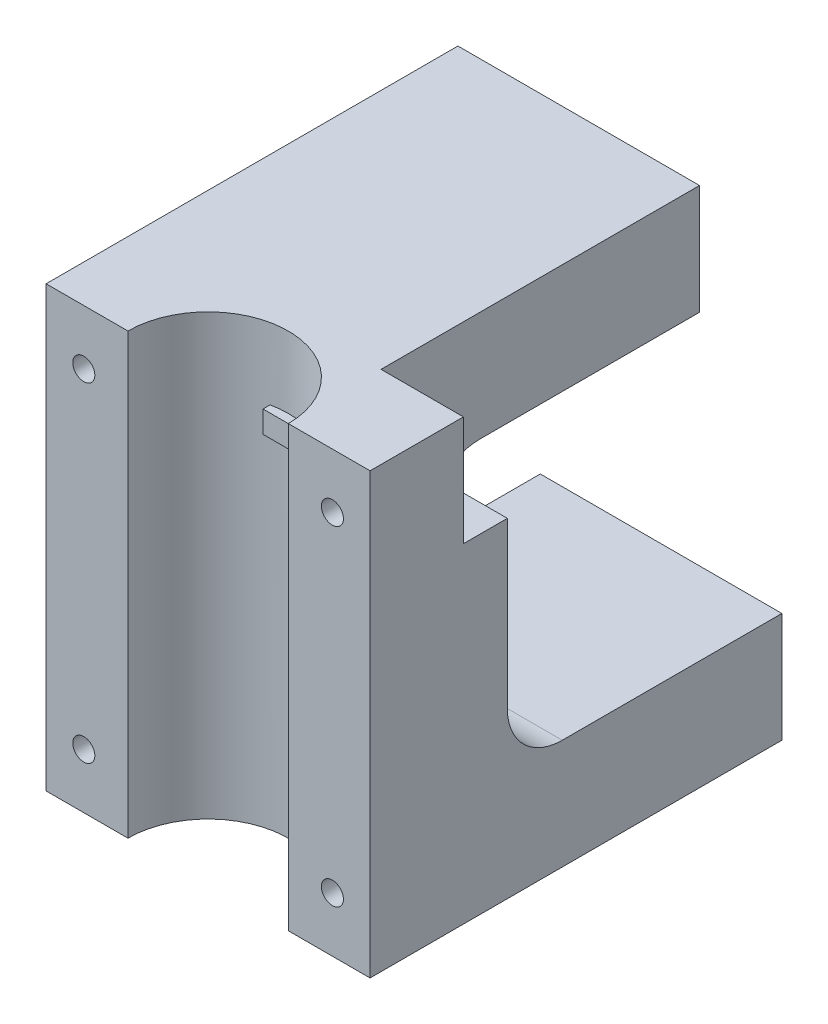
ISO-10303-21;
HEADER;
FILE_DESCRIPTION(('STEP AP214'),'2;1');
FILE_NAME('part.step','',(''),(''),'','','');
FILE_SCHEMA(('AUTOMOTIVE_DESIGN { 1 0 10303 214 1 1 1 1 }'));
ENDSEC;
DATA;
#1=APPLICATION_CONTEXT('core data for automotive mechanical design processes');
#2=APPLICATION_PROTOCOL_DEFINITION('international standard','automotive_design',2000,#1);
#3=PRODUCT_CONTEXT('',#1,'mechanical');
#4=PRODUCT('Part','Part','',(#3));
#5=PRODUCT_RELATED_PRODUCT_CATEGORY('part','',(#4));
#6=PRODUCT_DEFINITION_FORMATION('','',#4);
#7=PRODUCT_DEFINITION_CONTEXT('part definition',#1,'design');
#8=PRODUCT_DEFINITION('design','',#6,#7);
#9=PRODUCT_DEFINITION_SHAPE('','',#8);
#10=(LENGTH_UNIT() NAMED_UNIT(*) SI_UNIT(.MILLI.,.METRE.));
#11=(NAMED_UNIT(*) PLANE_ANGLE_UNIT() SI_UNIT($,.RADIAN.));
#12=(NAMED_UNIT(*) SI_UNIT($,.STERADIAN.) SOLID_ANGLE_UNIT());
#13=UNCERTAINTY_MEASURE_WITH_UNIT(LENGTH_MEASURE(1.E-05),#10,'distance_accuracy_value','');
#14=(GEOMETRIC_REPRESENTATION_CONTEXT(3) GLOBAL_UNCERTAINTY_ASSIGNED_CONTEXT((#13)) GLOBAL_UNIT_ASSIGNED_CONTEXT((#10,
#11,#12)) REPRESENTATION_CONTEXT('',''));
#15=CARTESIAN_POINT('',(0.,0.,0.));
#16=DIRECTION('',(0.,0.,1.));
#17=DIRECTION('',(1.,0.,0.));
#18=AXIS2_PLACEMENT_3D('',#15,#16,#17);
#19=CARTESIAN_POINT('',(0.,0.,-95.25));
#20=DIRECTION('',(0.,0.,-1.));
#21=DIRECTION('',(-1.,0.,0.));
#22=AXIS2_PLACEMENT_3D('',#19,#20,#21);
#23=PLANE('',#22);
#24=DIRECTION('',(1.,0.,0.));
#25=VECTOR('',#24,1.);
#26=CARTESIAN_POINT('',(-37.465,25.4,-95.25));
#27=LINE('',#26,#25);
#28=CARTESIAN_POINT('',(-37.465,25.4,-95.25));
#29=VERTEX_POINT('',#28);
#30=CARTESIAN_POINT('',(18.415,25.4,-95.25));
#31=VERTEX_POINT('',#30);
#32=EDGE_CURVE('E362',#29,#31,#27,.T.);
#33=ORIENTED_EDGE('',*,*,#32,.F.);
#34=DIRECTION('',(0.,-1.,0.));
#35=VECTOR('',#34,1.);
#36=CARTESIAN_POINT('',(-37.465,-50.8,-95.25));
#37=LINE('',#36,#35);
#38=CARTESIAN_POINT('',(-37.465,50.8,-95.25));
#39=VERTEX_POINT('',#38);
#40=EDGE_CURVE('E289',#39,#29,#37,.T.);
#41=ORIENTED_EDGE('',*,*,#40,.F.);
#42=DIRECTION('',(-1.,0.,0.));
#43=VECTOR('',#42,1.);
#44=CARTESIAN_POINT('',(-37.465,50.8,-95.25));
#45=LINE('',#44,#43);
#46=CARTESIAN_POINT('',(18.415,50.8,-95.25));
#47=VERTEX_POINT('',#46);
#48=EDGE_CURVE('E286',#47,#39,#45,.T.);
#49=ORIENTED_EDGE('',*,*,#48,.F.);
#50=DIRECTION('',(0.,1.,0.));
#51=VECTOR('',#50,1.);
#52=CARTESIAN_POINT('',(18.415,25.4,-95.25));
#53=LINE('',#52,#51);
#54=EDGE_CURVE('E230',#31,#47,#53,.T.);
#55=ORIENTED_EDGE('',*,*,#54,.F.);
#56=EDGE_LOOP('',(#33,#41,#49,#55));
#57=FACE_BOUND('',#56,.T.);
#58=CARTESIAN_POINT('',(-28.7528,38.1,-95.25));
#59=DIRECTION('',(0.,0.,1.));
#60=DIRECTION('',(1.,0.,0.));
#61=AXIS2_PLACEMENT_3D('',#58,#59,#60);
#62=CIRCLE('',#61,2.55269999999999);
#63=CARTESIAN_POINT('',(-26.2001,38.1,-95.25));
#64=VERTEX_POINT('',#63);
#65=EDGE_CURVE('E240',#64,#64,#62,.T.);
#66=ORIENTED_EDGE('',*,*,#65,.T.);
#67=EDGE_LOOP('',(#66));
#68=FACE_BOUND('',#67,.T.);
#69=ADVANCED_FACE('F38',(#57,#68),#23,.T.);
#70=CARTESIAN_POINT('',(37.465,25.4,-21.59));
#71=DIRECTION('',(0.,-1.,0.));
#72=DIRECTION('',(1.,0.,0.));
#73=AXIS2_PLACEMENT_3D('',#70,#71,#72);
#74=PLANE('',#73);
#75=DIRECTION('',(1.,0.,0.));
#76=VECTOR('',#75,1.);
#77=CARTESIAN_POINT('',(-37.465,25.4,-31.75));
#78=LINE('',#77,#76);
#79=CARTESIAN_POINT('',(18.415,25.4,-31.75));
#80=VERTEX_POINT('',#79);
#81=CARTESIAN_POINT('',(37.465,25.4,-31.75));
#82=VERTEX_POINT('',#81);
#83=EDGE_CURVE('E207',#80,#82,#78,.T.);
#84=ORIENTED_EDGE('',*,*,#83,.F.);
#85=DIRECTION('',(0.,0.,-1.));
#86=VECTOR('',#85,1.);
#87=CARTESIAN_POINT('',(18.415,25.4,-21.59));
#88=LINE('',#87,#86);
#89=CARTESIAN_POINT('',(18.415,25.4,-21.59));
#90=VERTEX_POINT('',#89);
#91=EDGE_CURVE('E414',#90,#80,#88,.T.);
#92=ORIENTED_EDGE('',*,*,#91,.F.);
#93=DIRECTION('',(-1.,0.,0.));
#94=VECTOR('',#93,1.);
#95=CARTESIAN_POINT('',(37.465,25.4,-21.59));
#96=LINE('',#95,#94);
#97=CARTESIAN_POINT('',(37.465,25.4,-21.59));
#98=VERTEX_POINT('',#97);
#99=EDGE_CURVE('E406',#98,#90,#96,.T.);
#100=ORIENTED_EDGE('',*,*,#99,.F.);
#101=DIRECTION('',(0.,0.,-1.));
#102=VECTOR('',#101,1.);
#103=CARTESIAN_POINT('',(37.465,25.4,-21.59));
#104=LINE('',#103,#102);
#105=EDGE_CURVE('E222',#98,#82,#104,.T.);
#106=ORIENTED_EDGE('',*,*,#105,.T.);
#107=EDGE_LOOP('',(#84,#92,#100,#106));
#108=FACE_BOUND('',#107,.T.);
#109=ADVANCED_FACE('F419',(#108),#74,.F.);
#110=CARTESIAN_POINT('',(-37.465,-25.4,-21.59));
#111=DIRECTION('',(0.,1.,0.));
#112=DIRECTION('',(-1.,0.,0.));
#113=AXIS2_PLACEMENT_3D('',#110,#111,#112);
#114=PLANE('',#113);
#115=DIRECTION('',(-1.,0.,0.));
#116=VECTOR('',#115,1.);
#117=CARTESIAN_POINT('',(-37.465,-25.4,-31.75));
#118=LINE('',#117,#116);
#119=CARTESIAN_POINT('',(-18.415,-25.4,-31.75));
#120=VERTEX_POINT('',#119);
#121=CARTESIAN_POINT('',(-37.465,-25.4,-31.75));
#122=VERTEX_POINT('',#121);
#123=EDGE_CURVE('E185',#120,#122,#118,.T.);
#124=ORIENTED_EDGE('',*,*,#123,.F.);
#125=DIRECTION('',(0.,0.,-1.));
#126=VECTOR('',#125,1.);
#127=CARTESIAN_POINT('',(-18.415,-25.4,-21.59));
#128=LINE('',#127,#126);
#129=CARTESIAN_POINT('',(-18.415,-25.4,-21.59));
#130=VERTEX_POINT('',#129);
#131=EDGE_CURVE('E215',#130,#120,#128,.T.);
#132=ORIENTED_EDGE('',*,*,#131,.F.);
#133=DIRECTION('',(1.,0.,0.));
#134=VECTOR('',#133,1.);
#135=CARTESIAN_POINT('',(-37.465,-25.4,-21.59));
#136=LINE('',#135,#134);
#137=CARTESIAN_POINT('',(-37.465,-25.4,-21.59));
#138=VERTEX_POINT('',#137);
#139=EDGE_CURVE('E212',#138,#130,#136,.T.);
#140=ORIENTED_EDGE('',*,*,#139,.F.);
#141=DIRECTION('',(0.,0.,-1.));
#142=VECTOR('',#141,1.);
#143=CARTESIAN_POINT('',(-37.465,-25.4,-21.59));
#144=LINE('',#143,#142);
#145=EDGE_CURVE('E205',#138,#122,#144,.T.);
#146=ORIENTED_EDGE('',*,*,#145,.T.);
#147=EDGE_LOOP('',(#124,#132,#140,#146));
#148=FACE_BOUND('',#147,.T.);
#149=ADVANCED_FACE('F210',(#148),#114,.F.);
#150=CARTESIAN_POINT('',(-28.7528,-38.1,0.));
#151=DIRECTION('',(0.,0.,1.));
#152=DIRECTION('',(1.,0.,0.));
#153=AXIS2_PLACEMENT_3D('',#150,#151,#152);
#154=CYLINDRICAL_SURFACE('',#153,2.55269999999999);
#155=CARTESIAN_POINT('',(-28.7528,-38.1,0.));
#156=DIRECTION('',(0.,0.,1.));
#157=DIRECTION('',(1.,0.,0.));
#158=AXIS2_PLACEMENT_3D('',#155,#156,#157);
#159=CIRCLE('',#158,2.55269999999999);
#160=CARTESIAN_POINT('',(-26.2001,-38.1,0.));
#161=VERTEX_POINT('',#160);
#162=EDGE_CURVE('E247',#161,#161,#159,.T.);
#163=ORIENTED_EDGE('',*,*,#162,.T.);
#164=EDGE_LOOP('',(#163));
#165=FACE_BOUND('',#164,.T.);
#166=CARTESIAN_POINT('',(-28.7528,-38.1,-21.59));
#167=DIRECTION('',(0.,0.,-1.));
#168=DIRECTION('',(-1.,0.,0.));
#169=AXIS2_PLACEMENT_3D('',#166,#167,#168);
#170=CIRCLE('',#169,2.55269999999999);
#171=CARTESIAN_POINT('',(-31.3055,-38.1,-21.59));
#172=VERTEX_POINT('',#171);
#173=EDGE_CURVE('E241',#172,#172,#170,.F.);
#174=ORIENTED_EDGE('',*,*,#173,.F.);
#175=EDGE_LOOP('',(#174));
#176=FACE_BOUND('',#175,.T.);
#177=ADVANCED_FACE('F497',(#165,#176),#154,.F.);
#178=CARTESIAN_POINT('',(28.7528,38.1,0.));
#179=DIRECTION('',(0.,0.,1.));
#180=DIRECTION('',(1.,0.,0.));
#181=AXIS2_PLACEMENT_3D('',#178,#179,#180);
#182=CYLINDRICAL_SURFACE('',#181,2.55269999999999);
#183=CARTESIAN_POINT('',(28.7528,38.1,0.));
#184=DIRECTION('',(0.,0.,1.));
#185=DIRECTION('',(1.,0.,0.));
#186=AXIS2_PLACEMENT_3D('',#183,#184,#185);
#187=CIRCLE('',#186,2.55269999999999);
#188=CARTESIAN_POINT('',(31.3055,38.1,0.));
#189=VERTEX_POINT('',#188);
#190=EDGE_CURVE('E244',#189,#189,#187,.T.);
#191=ORIENTED_EDGE('',*,*,#190,.T.);
#192=EDGE_LOOP('',(#191));
#193=FACE_BOUND('',#192,.T.);
#194=CARTESIAN_POINT('',(28.7528,38.1,-21.59));
#195=DIRECTION('',(0.,0.,-1.));
#196=DIRECTION('',(-1.,0.,0.));
#197=AXIS2_PLACEMENT_3D('',#194,#195,#196);
#198=CIRCLE('',#197,2.55269999999999);
#199=CARTESIAN_POINT('',(26.2001,38.1,-21.59));
#200=VERTEX_POINT('',#199);
#201=EDGE_CURVE('E332',#200,#200,#198,.F.);
#202=ORIENTED_EDGE('',*,*,#201,.F.);
#203=EDGE_LOOP('',(#202));
#204=FACE_BOUND('',#203,.T.);
#205=ADVANCED_FACE('F503',(#193,#204),#182,.F.);
#206=CARTESIAN_POINT('',(0.,0.,0.));
#207=DIRECTION('',(0.,0.,-1.));
#208=DIRECTION('',(-1.,0.,0.));
#209=AXIS2_PLACEMENT_3D('',#206,#207,#208);
#210=PLANE('',#209);
#211=CARTESIAN_POINT('',(-28.7528,38.1,0.));
#212=DIRECTION('',(0.,0.,1.));
#213=DIRECTION('',(1.,0.,0.));
#214=AXIS2_PLACEMENT_3D('',#211,#212,#213);
#215=CIRCLE('',#214,2.55269999999999);
#216=CARTESIAN_POINT('',(-26.2001,38.1,0.));
#217=VERTEX_POINT('',#216);
#218=EDGE_CURVE('E237',#217,#217,#215,.T.);
#219=ORIENTED_EDGE('',*,*,#218,.F.);
#220=EDGE_LOOP('',(#219));
#221=FACE_BOUND('',#220,.T.);
#222=DIRECTION('',(1.,0.,0.));
#223=VECTOR('',#222,1.);
#224=CARTESIAN_POINT('',(-37.465,-50.8,0.));
#225=LINE('',#224,#223);
#226=CARTESIAN_POINT('',(-37.465,-50.8,0.));
#227=VERTEX_POINT('',#226);
#228=CARTESIAN_POINT('',(-18.542,-50.8,0.));
#229=VERTEX_POINT('',#228);
#230=EDGE_CURVE('E287',#227,#229,#225,.T.);
#231=ORIENTED_EDGE('',*,*,#230,.T.);
#232=DIRECTION('',(0.,-1.,0.));
#233=VECTOR('',#232,1.);
#234=CARTESIAN_POINT('',(-18.542,375.480405737392,0.));
#235=LINE('',#234,#233);
#236=CARTESIAN_POINT('',(-18.542,50.8,0.));
#237=VERTEX_POINT('',#236);
#238=EDGE_CURVE('E310',#229,#237,#235,.F.);
#239=ORIENTED_EDGE('',*,*,#238,.T.);
#240=DIRECTION('',(-1.,0.,0.));
#241=VECTOR('',#240,1.);
#242=CARTESIAN_POINT('',(-37.465,50.8,0.));
#243=LINE('',#242,#241);
#244=CARTESIAN_POINT('',(-37.465,50.8,0.));
#245=VERTEX_POINT('',#244);
#246=EDGE_CURVE('E297',#237,#245,#243,.T.);
#247=ORIENTED_EDGE('',*,*,#246,.T.);
#248=DIRECTION('',(0.,-1.,0.));
#249=VECTOR('',#248,1.);
#250=CARTESIAN_POINT('',(-37.465,-50.8,0.));
#251=LINE('',#250,#249);
#252=EDGE_CURVE('E301',#245,#227,#251,.T.);
#253=ORIENTED_EDGE('',*,*,#252,.T.);
#254=EDGE_LOOP('',(#231,#239,#247,#253));
#255=FACE_BOUND('',#254,.T.);
#256=ORIENTED_EDGE('',*,*,#162,.F.);
#257=EDGE_LOOP('',(#256));
#258=FACE_BOUND('',#257,.T.);
#259=ADVANCED_FACE('F381',(#221,#255,#258),#210,.F.);
#260=ORIENTED_EDGE('',*,*,#190,.F.);
#261=EDGE_LOOP('',(#260));
#262=FACE_BOUND('',#261,.T.);
#263=CARTESIAN_POINT('',(28.7528,-38.1,0.));
#264=DIRECTION('',(0.,0.,1.));
#265=DIRECTION('',(1.,0.,0.));
#266=AXIS2_PLACEMENT_3D('',#263,#264,#265);
#267=CIRCLE('',#266,2.55269999999999);
#268=CARTESIAN_POINT('',(31.3055,-38.1,0.));
#269=VERTEX_POINT('',#268);
#270=EDGE_CURVE('E250',#269,#269,#267,.T.);
#271=ORIENTED_EDGE('',*,*,#270,.F.);
#272=EDGE_LOOP('',(#271));
#273=FACE_BOUND('',#272,.T.);
#274=CARTESIAN_POINT('',(37.465,50.8,0.));
#275=VERTEX_POINT('',#274);
#276=CARTESIAN_POINT('',(18.542,50.8,0.));
#277=VERTEX_POINT('',#276);
#278=EDGE_CURVE('E298',#275,#277,#243,.T.);
#279=ORIENTED_EDGE('',*,*,#278,.T.);
#280=DIRECTION('',(0.,-1.,0.));
#281=VECTOR('',#280,1.);
#282=CARTESIAN_POINT('',(18.542,375.480405737392,0.));
#283=LINE('',#282,#281);
#284=CARTESIAN_POINT('',(18.542,-50.8,0.));
#285=VERTEX_POINT('',#284);
#286=EDGE_CURVE('E319',#277,#285,#283,.T.);
#287=ORIENTED_EDGE('',*,*,#286,.T.);
#288=CARTESIAN_POINT('',(37.465,-50.8,0.));
#289=VERTEX_POINT('',#288);
#290=EDGE_CURVE('E304',#285,#289,#225,.T.);
#291=ORIENTED_EDGE('',*,*,#290,.T.);
#292=DIRECTION('',(0.,1.,0.));
#293=VECTOR('',#292,1.);
#294=CARTESIAN_POINT('',(37.465,-50.8,0.));
#295=LINE('',#294,#293);
#296=EDGE_CURVE('E282',#289,#275,#295,.T.);
#297=ORIENTED_EDGE('',*,*,#296,.T.);
#298=EDGE_LOOP('',(#279,#287,#291,#297));
#299=FACE_BOUND('',#298,.T.);
#300=ADVANCED_FACE('F429',(#262,#273,#299),#210,.F.);
#301=CARTESIAN_POINT('',(37.465,-50.8,-95.25));
#302=DIRECTION('',(1.,0.,0.));
#303=DIRECTION('',(0.,0.,-1.));
#304=AXIS2_PLACEMENT_3D('',#301,#302,#303);
#305=PLANE('',#304);
#306=DIRECTION('',(0.,0.,-1.));
#307=VECTOR('',#306,1.);
#308=CARTESIAN_POINT('',(37.465,-25.4,-31.75));
#309=LINE('',#308,#307);
#310=CARTESIAN_POINT('',(37.465,-25.4,-44.45));
#311=VERTEX_POINT('',#310);
#312=CARTESIAN_POINT('',(37.465,-25.4,-95.25));
#313=VERTEX_POINT('',#312);
#314=EDGE_CURVE('E357',#311,#313,#309,.T.);
#315=ORIENTED_EDGE('',*,*,#314,.F.);
#316=CARTESIAN_POINT('',(37.465,-12.7,-44.45));
#317=DIRECTION('',(1.,0.,0.));
#318=DIRECTION('',(0.,0.,-1.));
#319=AXIS2_PLACEMENT_3D('',#316,#317,#318);
#320=CIRCLE('',#319,12.7);
#321=CARTESIAN_POINT('',(37.465,-12.7,-31.75));
#322=VERTEX_POINT('',#321);
#323=EDGE_CURVE('E349',#311,#322,#320,.F.);
#324=ORIENTED_EDGE('',*,*,#323,.T.);
#325=DIRECTION('',(0.,-1.,0.));
#326=VECTOR('',#325,1.);
#327=CARTESIAN_POINT('',(37.465,-25.4,-31.75));
#328=LINE('',#327,#326);
#329=EDGE_CURVE('E208',#82,#322,#328,.T.);
#330=ORIENTED_EDGE('',*,*,#329,.F.);
#331=ORIENTED_EDGE('',*,*,#105,.F.);
#332=DIRECTION('',(0.,-1.,0.));
#333=VECTOR('',#332,1.);
#334=CARTESIAN_POINT('',(37.465,50.8,-21.59));
#335=LINE('',#334,#333);
#336=CARTESIAN_POINT('',(37.465,50.8,-21.59));
#337=VERTEX_POINT('',#336);
#338=EDGE_CURVE('E403',#337,#98,#335,.T.);
#339=ORIENTED_EDGE('',*,*,#338,.F.);
#340=DIRECTION('',(0.,0.,1.));
#341=VECTOR('',#340,1.);
#342=CARTESIAN_POINT('',(37.465,50.8,-95.25));
#343=LINE('',#342,#341);
#344=EDGE_CURVE('E294',#337,#275,#343,.T.);
#345=ORIENTED_EDGE('',*,*,#344,.T.);
#346=ORIENTED_EDGE('',*,*,#296,.F.);
#347=DIRECTION('',(0.,0.,1.));
#348=VECTOR('',#347,1.);
#349=CARTESIAN_POINT('',(37.465,-50.8,-95.25));
#350=LINE('',#349,#348);
#351=CARTESIAN_POINT('',(37.465,-50.8,-95.25));
#352=VERTEX_POINT('',#351);
#353=EDGE_CURVE('E307',#352,#289,#350,.T.);
#354=ORIENTED_EDGE('',*,*,#353,.F.);
#355=DIRECTION('',(0.,1.,0.));
#356=VECTOR('',#355,1.);
#357=CARTESIAN_POINT('',(37.465,-50.8,-95.25));
#358=LINE('',#357,#356);
#359=EDGE_CURVE('E283',#352,#313,#358,.T.);
#360=ORIENTED_EDGE('',*,*,#359,.T.);
#361=EDGE_LOOP('',(#315,#324,#330,#331,#339,#345,#346,#354,#360));
#362=FACE_BOUND('',#361,.T.);
#363=ADVANCED_FACE('F354',(#362),#305,.T.);
#364=CARTESIAN_POINT('',(-37.465,-50.8,-95.25));
#365=DIRECTION('',(0.,-1.,0.));
#366=DIRECTION('',(0.,0.,-1.));
#367=AXIS2_PLACEMENT_3D('',#364,#365,#366);
#368=PLANE('',#367);
#369=DIRECTION('',(0.,0.,-1.));
#370=VECTOR('',#369,1.);
#371=CARTESIAN_POINT('',(-18.415,-50.8,-21.59));
#372=LINE('',#371,#370);
#373=CARTESIAN_POINT('',(-18.415,-50.8,-21.59));
#374=VERTEX_POINT('',#373);
#375=CARTESIAN_POINT('',(-18.415,-50.8,-95.25));
#376=VERTEX_POINT('',#375);
#377=EDGE_CURVE('E225',#374,#376,#372,.T.);
#378=ORIENTED_EDGE('',*,*,#377,.T.);
#379=DIRECTION('',(1.,0.,0.));
#380=VECTOR('',#379,1.);
#381=CARTESIAN_POINT('',(-37.465,-50.8,-95.25));
#382=LINE('',#381,#380);
#383=EDGE_CURVE('E292',#376,#352,#382,.T.);
#384=ORIENTED_EDGE('',*,*,#383,.T.);
#385=ORIENTED_EDGE('',*,*,#353,.T.);
#386=ORIENTED_EDGE('',*,*,#290,.F.);
#387=CARTESIAN_POINT('',(0.,-50.8,0.));
#388=DIRECTION('',(0.,-1.,0.));
#389=DIRECTION('',(0.,0.,-1.));
#390=AXIS2_PLACEMENT_3D('',#387,#388,#389);
#391=CIRCLE('',#390,18.542);
#392=EDGE_CURVE('E280',#229,#285,#391,.T.);
#393=ORIENTED_EDGE('',*,*,#392,.F.);
#394=ORIENTED_EDGE('',*,*,#230,.F.);
#395=DIRECTION('',(0.,0.,1.));
#396=VECTOR('',#395,1.);
#397=CARTESIAN_POINT('',(-37.465,-50.8,-95.25));
#398=LINE('',#397,#396);
#399=CARTESIAN_POINT('',(-37.465,-50.8,-21.59));
#400=VERTEX_POINT('',#399);
#401=EDGE_CURVE('E311',#400,#227,#398,.T.);
#402=ORIENTED_EDGE('',*,*,#401,.F.);
#403=DIRECTION('',(-1.,0.,0.));
#404=VECTOR('',#403,1.);
#405=CARTESIAN_POINT('',(-18.415,-50.8,-21.59));
#406=LINE('',#405,#404);
#407=EDGE_CURVE('E231',#374,#400,#406,.T.);
#408=ORIENTED_EDGE('',*,*,#407,.F.);
#409=EDGE_LOOP('',(#378,#384,#385,#386,#393,#394,#402,#408));
#410=FACE_BOUND('',#409,.T.);
#411=ADVANCED_FACE('F377',(#410),#368,.T.);
#412=CARTESIAN_POINT('',(-37.465,-50.8,-95.25));
#413=DIRECTION('',(-1.,0.,0.));
#414=DIRECTION('',(0.,0.,1.));
#415=AXIS2_PLACEMENT_3D('',#412,#413,#414);
#416=PLANE('',#415);
#417=DIRECTION('',(0.,0.,-1.));
#418=VECTOR('',#417,1.);
#419=CARTESIAN_POINT('',(-37.465,25.4,-31.75));
#420=LINE('',#419,#418);
#421=CARTESIAN_POINT('',(-37.465,25.4,-44.45));
#422=VERTEX_POINT('',#421);
#423=EDGE_CURVE('E228',#422,#29,#420,.T.);
#424=ORIENTED_EDGE('',*,*,#423,.F.);
#425=CARTESIAN_POINT('',(-37.465,12.7,-44.45));
#426=DIRECTION('',(-1.,0.,0.));
#427=DIRECTION('',(0.,0.,1.));
#428=AXIS2_PLACEMENT_3D('',#425,#426,#427);
#429=CIRCLE('',#428,12.7);
#430=CARTESIAN_POINT('',(-37.465,12.7,-31.75));
#431=VERTEX_POINT('',#430);
#432=EDGE_CURVE('E11',#422,#431,#429,.F.);
#433=ORIENTED_EDGE('',*,*,#432,.T.);
#434=DIRECTION('',(0.,1.,0.));
#435=VECTOR('',#434,1.);
#436=CARTESIAN_POINT('',(-37.465,-25.4,-31.75));
#437=LINE('',#436,#435);
#438=EDGE_CURVE('E190',#122,#431,#437,.T.);
#439=ORIENTED_EDGE('',*,*,#438,.F.);
#440=ORIENTED_EDGE('',*,*,#145,.F.);
#441=DIRECTION('',(0.,1.,0.));
#442=VECTOR('',#441,1.);
#443=CARTESIAN_POINT('',(-37.465,-50.8,-21.59));
#444=LINE('',#443,#442);
#445=EDGE_CURVE('E234',#400,#138,#444,.T.);
#446=ORIENTED_EDGE('',*,*,#445,.F.);
#447=ORIENTED_EDGE('',*,*,#401,.T.);
#448=ORIENTED_EDGE('',*,*,#252,.F.);
#449=DIRECTION('',(0.,0.,1.));
#450=VECTOR('',#449,1.);
#451=CARTESIAN_POINT('',(-37.465,50.8,-95.25));
#452=LINE('',#451,#450);
#453=EDGE_CURVE('E313',#39,#245,#452,.T.);
#454=ORIENTED_EDGE('',*,*,#453,.F.);
#455=ORIENTED_EDGE('',*,*,#40,.T.);
#456=EDGE_LOOP('',(#424,#433,#439,#440,#446,#447,#448,#454,#455));
#457=FACE_BOUND('',#456,.T.);
#458=ADVANCED_FACE('F203',(#457),#416,.T.);
#459=CARTESIAN_POINT('',(-37.465,50.8,-95.25));
#460=DIRECTION('',(0.,1.,0.));
#461=DIRECTION('',(0.,0.,1.));
#462=AXIS2_PLACEMENT_3D('',#459,#460,#461);
#463=PLANE('',#462);
#464=DIRECTION('',(0.,0.,-1.));
#465=VECTOR('',#464,1.);
#466=CARTESIAN_POINT('',(18.415,50.8,-21.59));
#467=LINE('',#466,#465);
#468=CARTESIAN_POINT('',(18.415,50.8,-21.59));
#469=VERTEX_POINT('',#468);
#470=EDGE_CURVE('E335',#469,#47,#467,.T.);
#471=ORIENTED_EDGE('',*,*,#470,.T.);
#472=ORIENTED_EDGE('',*,*,#48,.T.);
#473=ORIENTED_EDGE('',*,*,#453,.T.);
#474=ORIENTED_EDGE('',*,*,#246,.F.);
#475=CARTESIAN_POINT('',(0.,50.8,0.));
#476=DIRECTION('',(0.,1.,0.));
#477=DIRECTION('',(0.,0.,1.));
#478=AXIS2_PLACEMENT_3D('',#475,#476,#477);
#479=CIRCLE('',#478,18.542);
#480=EDGE_CURVE('E278',#277,#237,#479,.T.);
#481=ORIENTED_EDGE('',*,*,#480,.F.);
#482=ORIENTED_EDGE('',*,*,#278,.F.);
#483=ORIENTED_EDGE('',*,*,#344,.F.);
#484=DIRECTION('',(1.,0.,0.));
#485=VECTOR('',#484,1.);
#486=CARTESIAN_POINT('',(18.415,50.8,-21.59));
#487=LINE('',#486,#485);
#488=EDGE_CURVE('E401',#469,#337,#487,.T.);
#489=ORIENTED_EDGE('',*,*,#488,.F.);
#490=EDGE_LOOP('',(#471,#472,#473,#474,#481,#482,#483,#489));
#491=FACE_BOUND('',#490,.T.);
#492=ADVANCED_FACE('F426',(#491),#463,.T.);
#493=DIRECTION('',(-1.,0.,0.));
#494=VECTOR('',#493,1.);
#495=CARTESIAN_POINT('',(-37.465,-25.4,-95.25));
#496=LINE('',#495,#494);
#497=CARTESIAN_POINT('',(-18.415,-25.4,-95.25));
#498=VERTEX_POINT('',#497);
#499=EDGE_CURVE('E393',#313,#498,#496,.T.);
#500=ORIENTED_EDGE('',*,*,#499,.F.);
#501=ORIENTED_EDGE('',*,*,#359,.F.);
#502=ORIENTED_EDGE('',*,*,#383,.F.);
#503=DIRECTION('',(0.,-1.,0.));
#504=VECTOR('',#503,1.);
#505=CARTESIAN_POINT('',(-18.415,-25.4,-95.25));
#506=LINE('',#505,#504);
#507=EDGE_CURVE('E229',#498,#376,#506,.T.);
#508=ORIENTED_EDGE('',*,*,#507,.F.);
#509=EDGE_LOOP('',(#500,#501,#502,#508));
#510=FACE_BOUND('',#509,.T.);
#511=CARTESIAN_POINT('',(28.7528,-38.1,-95.25));
#512=DIRECTION('',(0.,0.,1.));
#513=DIRECTION('',(1.,0.,0.));
#514=AXIS2_PLACEMENT_3D('',#511,#512,#513);
#515=CIRCLE('',#514,2.55269999999999);
#516=CARTESIAN_POINT('',(31.3055,-38.1,-95.25));
#517=VERTEX_POINT('',#516);
#518=EDGE_CURVE('E253',#517,#517,#515,.T.);
#519=ORIENTED_EDGE('',*,*,#518,.T.);
#520=EDGE_LOOP('',(#519));
#521=FACE_BOUND('',#520,.T.);
#522=ADVANCED_FACE('F435',(#510,#521),#23,.T.);
#523=CARTESIAN_POINT('',(0.,375.480405737392,0.));
#524=DIRECTION('',(0.,-1.,0.));
#525=DIRECTION('',(0.,0.,-1.));
#526=AXIS2_PLACEMENT_3D('',#523,#524,#525);
#527=CYLINDRICAL_SURFACE('',#526,18.542);
#528=DIRECTION('',(0.,-1.,0.));
#529=VECTOR('',#528,1.);
#530=CARTESIAN_POINT('',(-3.81,375.480405737392,-18.1463402370836));
#531=LINE('',#530,#529);
#532=CARTESIAN_POINT('',(-3.81,34.29,-18.1463402370836));
#533=VERTEX_POINT('',#532);
#534=CARTESIAN_POINT('',(-3.81,29.21,-18.1463402370836));
#535=VERTEX_POINT('',#534);
#536=EDGE_CURVE('E325',#533,#535,#531,.T.);
#537=ORIENTED_EDGE('',*,*,#536,.F.);
#538=CARTESIAN_POINT('',(0.,34.29,0.));
#539=DIRECTION('',(0.,1.,0.));
#540=DIRECTION('',(0.,0.,1.));
#541=AXIS2_PLACEMENT_3D('',#538,#539,#540);
#542=CIRCLE('',#541,18.542);
#543=CARTESIAN_POINT('',(3.81,34.29,-18.1463402370836));
#544=VERTEX_POINT('',#543);
#545=EDGE_CURVE('E199',#533,#544,#542,.F.);
#546=ORIENTED_EDGE('',*,*,#545,.T.);
#547=DIRECTION('',(0.,-1.,0.));
#548=VECTOR('',#547,1.);
#549=CARTESIAN_POINT('',(3.81,375.480405737392,-18.1463402370836));
#550=LINE('',#549,#548);
#551=CARTESIAN_POINT('',(3.81,29.21,-18.1463402370836));
#552=VERTEX_POINT('',#551);
#553=EDGE_CURVE('E328',#552,#544,#550,.F.);
#554=ORIENTED_EDGE('',*,*,#553,.F.);
#555=CARTESIAN_POINT('',(0.,29.21,0.));
#556=DIRECTION('',(0.,1.,0.));
#557=DIRECTION('',(0.,0.,1.));
#558=AXIS2_PLACEMENT_3D('',#555,#556,#557);
#559=CIRCLE('',#558,18.542);
#560=EDGE_CURVE('E322',#535,#552,#559,.F.);
#561=ORIENTED_EDGE('',*,*,#560,.F.);
#562=EDGE_LOOP('',(#537,#546,#554,#561));
#563=FACE_BOUND('',#562,.T.);
#564=ORIENTED_EDGE('',*,*,#238,.F.);
#565=ORIENTED_EDGE('',*,*,#392,.T.);
#566=ORIENTED_EDGE('',*,*,#286,.F.);
#567=ORIENTED_EDGE('',*,*,#480,.T.);
#568=EDGE_LOOP('',(#564,#565,#566,#567));
#569=FACE_BOUND('',#568,.T.);
#570=ADVANCED_FACE('F460',(#563,#569),#527,.F.);
#571=CARTESIAN_POINT('',(3.81,34.29,-16.51));
#572=DIRECTION('',(-1.,0.,0.));
#573=DIRECTION('',(0.,0.,1.));
#574=AXIS2_PLACEMENT_3D('',#571,#572,#573);
#575=PLANE('',#574);
#576=DIRECTION('',(0.,0.,-1.));
#577=VECTOR('',#576,1.);
#578=CARTESIAN_POINT('',(3.81,29.21,-16.51));
#579=LINE('',#578,#577);
#580=CARTESIAN_POINT('',(3.81,29.21,-16.51));
#581=VERTEX_POINT('',#580);
#582=EDGE_CURVE('E269',#581,#552,#579,.T.);
#583=ORIENTED_EDGE('',*,*,#582,.T.);
#584=ORIENTED_EDGE('',*,*,#553,.T.);
#585=DIRECTION('',(0.,0.,-1.));
#586=VECTOR('',#585,1.);
#587=CARTESIAN_POINT('',(3.81,34.29,-16.51));
#588=LINE('',#587,#586);
#589=CARTESIAN_POINT('',(3.81,34.29,-16.51));
#590=VERTEX_POINT('',#589);
#591=EDGE_CURVE('E260',#590,#544,#588,.T.);
#592=ORIENTED_EDGE('',*,*,#591,.F.);
#593=DIRECTION('',(0.,-1.,0.));
#594=VECTOR('',#593,1.);
#595=CARTESIAN_POINT('',(3.81,34.29,-16.51));
#596=LINE('',#595,#594);
#597=EDGE_CURVE('E275',#590,#581,#596,.T.);
#598=ORIENTED_EDGE('',*,*,#597,.T.);
#599=EDGE_LOOP('',(#583,#584,#592,#598));
#600=FACE_BOUND('',#599,.T.);
#601=ADVANCED_FACE('F466',(#600),#575,.F.);
#602=CARTESIAN_POINT('',(-3.81,34.29,-95.25));
#603=DIRECTION('',(1.,0.,0.));
#604=DIRECTION('',(0.,0.,-1.));
#605=AXIS2_PLACEMENT_3D('',#602,#603,#604);
#606=PLANE('',#605);
#607=DIRECTION('',(0.,0.,1.));
#608=VECTOR('',#607,1.);
#609=CARTESIAN_POINT('',(-3.81,34.29,-95.25));
#610=LINE('',#609,#608);
#611=CARTESIAN_POINT('',(-3.81,34.29,-16.51));
#612=VERTEX_POINT('',#611);
#613=EDGE_CURVE('E264',#533,#612,#610,.T.);
#614=ORIENTED_EDGE('',*,*,#613,.F.);
#615=ORIENTED_EDGE('',*,*,#536,.T.);
#616=DIRECTION('',(0.,0.,1.));
#617=VECTOR('',#616,1.);
#618=CARTESIAN_POINT('',(-3.81,29.21,-95.25));
#619=LINE('',#618,#617);
#620=CARTESIAN_POINT('',(-3.81,29.21,-16.51));
#621=VERTEX_POINT('',#620);
#622=EDGE_CURVE('E261',#535,#621,#619,.T.);
#623=ORIENTED_EDGE('',*,*,#622,.T.);
#624=DIRECTION('',(0.,-1.,0.));
#625=VECTOR('',#624,1.);
#626=CARTESIAN_POINT('',(-3.81,34.29,-16.51));
#627=LINE('',#626,#625);
#628=EDGE_CURVE('E266',#612,#621,#627,.T.);
#629=ORIENTED_EDGE('',*,*,#628,.F.);
#630=EDGE_LOOP('',(#614,#615,#623,#629));
#631=FACE_BOUND('',#630,.T.);
#632=ADVANCED_FACE('F518',(#631),#606,.F.);
#633=CARTESIAN_POINT('',(0.,34.29,0.));
#634=DIRECTION('',(0.,1.,0.));
#635=DIRECTION('',(0.,0.,1.));
#636=AXIS2_PLACEMENT_3D('',#633,#634,#635);
#637=PLANE('',#636);
#638=ORIENTED_EDGE('',*,*,#545,.F.);
#639=ORIENTED_EDGE('',*,*,#613,.T.);
#640=DIRECTION('',(1.,0.,0.));
#641=VECTOR('',#640,1.);
#642=CARTESIAN_POINT('',(-3.81,34.29,-16.51));
#643=LINE('',#642,#641);
#644=EDGE_CURVE('E257',#612,#590,#643,.T.);
#645=ORIENTED_EDGE('',*,*,#644,.T.);
#646=ORIENTED_EDGE('',*,*,#591,.T.);
#647=EDGE_LOOP('',(#638,#639,#645,#646));
#648=FACE_BOUND('',#647,.T.);
#649=ADVANCED_FACE('F514',(#648),#637,.T.);
#650=CARTESIAN_POINT('',(0.,29.21,0.));
#651=DIRECTION('',(0.,1.,0.));
#652=DIRECTION('',(0.,0.,1.));
#653=AXIS2_PLACEMENT_3D('',#650,#651,#652);
#654=PLANE('',#653);
#655=ORIENTED_EDGE('',*,*,#622,.F.);
#656=ORIENTED_EDGE('',*,*,#560,.T.);
#657=ORIENTED_EDGE('',*,*,#582,.F.);
#658=DIRECTION('',(1.,0.,0.));
#659=VECTOR('',#658,1.);
#660=CARTESIAN_POINT('',(-3.81,29.21,-16.51));
#661=LINE('',#660,#659);
#662=EDGE_CURVE('E256',#621,#581,#661,.T.);
#663=ORIENTED_EDGE('',*,*,#662,.F.);
#664=EDGE_LOOP('',(#655,#656,#657,#663));
#665=FACE_BOUND('',#664,.T.);
#666=ADVANCED_FACE('F517',(#665),#654,.F.);
#667=CARTESIAN_POINT('',(-3.81,34.29,-16.51));
#668=DIRECTION('',(0.,0.,-1.));
#669=DIRECTION('',(-1.,0.,0.));
#670=AXIS2_PLACEMENT_3D('',#667,#668,#669);
#671=PLANE('',#670);
#672=ORIENTED_EDGE('',*,*,#662,.T.);
#673=ORIENTED_EDGE('',*,*,#597,.F.);
#674=ORIENTED_EDGE('',*,*,#644,.F.);
#675=ORIENTED_EDGE('',*,*,#628,.T.);
#676=EDGE_LOOP('',(#672,#673,#674,#675));
#677=FACE_BOUND('',#676,.T.);
#678=ADVANCED_FACE('F512',(#677),#671,.F.);
#679=CARTESIAN_POINT('',(28.7528,-38.1,0.));
#680=DIRECTION('',(0.,0.,1.));
#681=DIRECTION('',(1.,0.,0.));
#682=AXIS2_PLACEMENT_3D('',#679,#680,#681);
#683=CYLINDRICAL_SURFACE('',#682,2.55269999999999);
#684=ORIENTED_EDGE('',*,*,#518,.F.);
#685=EDGE_LOOP('',(#684));
#686=FACE_BOUND('',#685,.T.);
#687=ORIENTED_EDGE('',*,*,#270,.T.);
#688=EDGE_LOOP('',(#687));
#689=FACE_BOUND('',#688,.T.);
#690=ADVANCED_FACE('F501',(#686,#689),#683,.F.);
#691=CARTESIAN_POINT('',(-28.7528,38.1,0.));
#692=DIRECTION('',(0.,0.,1.));
#693=DIRECTION('',(1.,0.,0.));
#694=AXIS2_PLACEMENT_3D('',#691,#692,#693);
#695=CYLINDRICAL_SURFACE('',#694,2.55269999999999);
#696=ORIENTED_EDGE('',*,*,#65,.F.);
#697=EDGE_LOOP('',(#696));
#698=FACE_BOUND('',#697,.T.);
#699=ORIENTED_EDGE('',*,*,#218,.T.);
#700=EDGE_LOOP('',(#699));
#701=FACE_BOUND('',#700,.T.);
#702=ADVANCED_FACE('F494',(#698,#701),#695,.F.);
#703=CARTESIAN_POINT('',(0.,0.,-21.59));
#704=DIRECTION('',(0.,0.,-1.));
#705=DIRECTION('',(-1.,0.,0.));
#706=AXIS2_PLACEMENT_3D('',#703,#704,#705);
#707=PLANE('',#706);
#708=ORIENTED_EDGE('',*,*,#488,.T.);
#709=ORIENTED_EDGE('',*,*,#338,.T.);
#710=ORIENTED_EDGE('',*,*,#99,.T.);
#711=DIRECTION('',(0.,1.,0.));
#712=VECTOR('',#711,1.);
#713=CARTESIAN_POINT('',(18.415,25.4,-21.59));
#714=LINE('',#713,#712);
#715=EDGE_CURVE('E409',#90,#469,#714,.T.);
#716=ORIENTED_EDGE('',*,*,#715,.T.);
#717=EDGE_LOOP('',(#708,#709,#710,#716));
#718=FACE_BOUND('',#717,.T.);
#719=ORIENTED_EDGE('',*,*,#201,.T.);
#720=EDGE_LOOP('',(#719));
#721=FACE_BOUND('',#720,.T.);
#722=ADVANCED_FACE('F486',(#718,#721),#707,.T.);
#723=CARTESIAN_POINT('',(18.415,25.4,-21.59));
#724=DIRECTION('',(-1.,0.,0.));
#725=DIRECTION('',(0.,0.,1.));
#726=AXIS2_PLACEMENT_3D('',#723,#724,#725);
#727=PLANE('',#726);
#728=ORIENTED_EDGE('',*,*,#54,.T.);
#729=ORIENTED_EDGE('',*,*,#470,.F.);
#730=ORIENTED_EDGE('',*,*,#715,.F.);
#731=ORIENTED_EDGE('',*,*,#91,.T.);
#732=DIRECTION('',(0.,1.,0.));
#733=VECTOR('',#732,1.);
#734=CARTESIAN_POINT('',(18.415,0.,-31.75));
#735=LINE('',#734,#733);
#736=CARTESIAN_POINT('',(18.415,12.7,-31.75));
#737=VERTEX_POINT('',#736);
#738=EDGE_CURVE('E198',#737,#80,#735,.T.);
#739=ORIENTED_EDGE('',*,*,#738,.F.);
#740=CARTESIAN_POINT('',(18.415,12.7,-44.45));
#741=DIRECTION('',(-1.,0.,0.));
#742=DIRECTION('',(0.,0.,1.));
#743=AXIS2_PLACEMENT_3D('',#740,#741,#742);
#744=CIRCLE('',#743,12.7);
#745=CARTESIAN_POINT('',(18.415,25.4,-44.45));
#746=VERTEX_POINT('',#745);
#747=EDGE_CURVE('E46',#737,#746,#744,.T.);
#748=ORIENTED_EDGE('',*,*,#747,.T.);
#749=EDGE_CURVE('E416',#746,#31,#88,.T.);
#750=ORIENTED_EDGE('',*,*,#749,.T.);
#751=EDGE_LOOP('',(#728,#729,#730,#731,#739,#748,#750));
#752=FACE_BOUND('',#751,.T.);
#753=ADVANCED_FACE('F484',(#752),#727,.F.);
#754=CARTESIAN_POINT('',(0.,0.,-21.59));
#755=DIRECTION('',(0.,0.,-1.));
#756=DIRECTION('',(-1.,0.,0.));
#757=AXIS2_PLACEMENT_3D('',#754,#755,#756);
#758=PLANE('',#757);
#759=ORIENTED_EDGE('',*,*,#407,.T.);
#760=ORIENTED_EDGE('',*,*,#445,.T.);
#761=ORIENTED_EDGE('',*,*,#139,.T.);
#762=DIRECTION('',(0.,-1.,0.));
#763=VECTOR('',#762,1.);
#764=CARTESIAN_POINT('',(-18.415,-25.4,-21.59));
#765=LINE('',#764,#763);
#766=EDGE_CURVE('E214',#130,#374,#765,.T.);
#767=ORIENTED_EDGE('',*,*,#766,.T.);
#768=EDGE_LOOP('',(#759,#760,#761,#767));
#769=FACE_BOUND('',#768,.T.);
#770=ORIENTED_EDGE('',*,*,#173,.T.);
#771=EDGE_LOOP('',(#770));
#772=FACE_BOUND('',#771,.T.);
#773=ADVANCED_FACE('F370',(#769,#772),#758,.T.);
#774=CARTESIAN_POINT('',(-18.415,-25.4,-21.59));
#775=DIRECTION('',(1.,0.,0.));
#776=DIRECTION('',(0.,1.,0.));
#777=AXIS2_PLACEMENT_3D('',#774,#775,#776);
#778=PLANE('',#777);
#779=ORIENTED_EDGE('',*,*,#507,.T.);
#780=ORIENTED_EDGE('',*,*,#377,.F.);
#781=ORIENTED_EDGE('',*,*,#766,.F.);
#782=ORIENTED_EDGE('',*,*,#131,.T.);
#783=DIRECTION('',(0.,-1.,0.));
#784=VECTOR('',#783,1.);
#785=CARTESIAN_POINT('',(-18.415,0.,-31.75));
#786=LINE('',#785,#784);
#787=CARTESIAN_POINT('',(-18.415,-12.7,-31.75));
#788=VERTEX_POINT('',#787);
#789=EDGE_CURVE('E194',#788,#120,#786,.T.);
#790=ORIENTED_EDGE('',*,*,#789,.F.);
#791=CARTESIAN_POINT('',(-18.415,-12.7,-44.45));
#792=DIRECTION('',(1.,0.,0.));
#793=DIRECTION('',(0.,1.,0.));
#794=AXIS2_PLACEMENT_3D('',#791,#792,#793);
#795=CIRCLE('',#794,12.7);
#796=CARTESIAN_POINT('',(-18.415,-25.4,-44.45));
#797=VERTEX_POINT('',#796);
#798=EDGE_CURVE('E347',#788,#797,#795,.T.);
#799=ORIENTED_EDGE('',*,*,#798,.T.);
#800=EDGE_CURVE('E219',#797,#498,#128,.T.);
#801=ORIENTED_EDGE('',*,*,#800,.T.);
#802=EDGE_LOOP('',(#779,#780,#781,#782,#790,#799,#801));
#803=FACE_BOUND('',#802,.T.);
#804=ADVANCED_FACE('F367',(#803),#778,.F.);
#805=CARTESIAN_POINT('',(-37.465,25.4,-31.75));
#806=DIRECTION('',(0.,1.,0.));
#807=DIRECTION('',(0.,0.,1.));
#808=AXIS2_PLACEMENT_3D('',#805,#806,#807);
#809=PLANE('',#808);
#810=ORIENTED_EDGE('',*,*,#749,.F.);
#811=DIRECTION('',(1.,0.,0.));
#812=VECTOR('',#811,1.);
#813=CARTESIAN_POINT('',(-37.465,25.4,-44.45));
#814=LINE('',#813,#812);
#815=EDGE_CURVE('E59',#746,#422,#814,.F.);
#816=ORIENTED_EDGE('',*,*,#815,.T.);
#817=ORIENTED_EDGE('',*,*,#423,.T.);
#818=ORIENTED_EDGE('',*,*,#32,.T.);
#819=EDGE_LOOP('',(#810,#816,#817,#818));
#820=FACE_BOUND('',#819,.T.);
#821=ADVANCED_FACE('F441',(#820),#809,.F.);
#822=CARTESIAN_POINT('',(-37.465,-25.4,-31.75));
#823=DIRECTION('',(0.,-1.,0.));
#824=DIRECTION('',(0.,0.,-1.));
#825=AXIS2_PLACEMENT_3D('',#822,#823,#824);
#826=PLANE('',#825);
#827=ORIENTED_EDGE('',*,*,#800,.F.);
#828=DIRECTION('',(-1.,0.,0.));
#829=VECTOR('',#828,1.);
#830=CARTESIAN_POINT('',(-37.465,-25.4,-44.45));
#831=LINE('',#830,#829);
#832=EDGE_CURVE('E344',#797,#311,#831,.F.);
#833=ORIENTED_EDGE('',*,*,#832,.T.);
#834=ORIENTED_EDGE('',*,*,#314,.T.);
#835=ORIENTED_EDGE('',*,*,#499,.T.);
#836=EDGE_LOOP('',(#827,#833,#834,#835));
#837=FACE_BOUND('',#836,.T.);
#838=ADVANCED_FACE('F439',(#837),#826,.F.);
#839=CARTESIAN_POINT('',(0.,0.,-31.75));
#840=DIRECTION('',(0.,0.,-1.));
#841=DIRECTION('',(-1.,0.,0.));
#842=AXIS2_PLACEMENT_3D('',#839,#840,#841);
#843=PLANE('',#842);
#844=ORIENTED_EDGE('',*,*,#329,.T.);
#845=DIRECTION('',(-1.,0.,0.));
#846=VECTOR('',#845,1.);
#847=CARTESIAN_POINT('',(0.,-12.7,-31.75));
#848=LINE('',#847,#846);
#849=EDGE_CURVE('E342',#322,#788,#848,.T.);
#850=ORIENTED_EDGE('',*,*,#849,.T.);
#851=ORIENTED_EDGE('',*,*,#789,.T.);
#852=ORIENTED_EDGE('',*,*,#123,.T.);
#853=ORIENTED_EDGE('',*,*,#438,.T.);
#854=DIRECTION('',(1.,0.,0.));
#855=VECTOR('',#854,1.);
#856=CARTESIAN_POINT('',(0.,12.7,-31.75));
#857=LINE('',#856,#855);
#858=EDGE_CURVE('E339',#431,#737,#857,.T.);
#859=ORIENTED_EDGE('',*,*,#858,.T.);
#860=ORIENTED_EDGE('',*,*,#738,.T.);
#861=ORIENTED_EDGE('',*,*,#83,.T.);
#862=EDGE_LOOP('',(#844,#850,#851,#852,#853,#859,#860,#861));
#863=FACE_BOUND('',#862,.T.);
#864=ADVANCED_FACE('F188',(#863),#843,.T.);
#865=CARTESIAN_POINT('',(0.,-12.7,-44.45));
#866=DIRECTION('',(-1.,0.,0.));
#867=DIRECTION('',(0.,0.,1.));
#868=AXIS2_PLACEMENT_3D('',#865,#866,#867);
#869=CYLINDRICAL_SURFACE('',#868,12.7);
#870=ORIENTED_EDGE('',*,*,#323,.F.);
#871=ORIENTED_EDGE('',*,*,#832,.F.);
#872=ORIENTED_EDGE('',*,*,#798,.F.);
#873=ORIENTED_EDGE('',*,*,#849,.F.);
#874=EDGE_LOOP('',(#870,#871,#872,#873));
#875=FACE_BOUND('',#874,.T.);
#876=ADVANCED_FACE('F364',(#875),#869,.F.);
#877=CARTESIAN_POINT('',(0.,12.7,-44.45));
#878=DIRECTION('',(1.,0.,0.));
#879=DIRECTION('',(0.,0.,-1.));
#880=AXIS2_PLACEMENT_3D('',#877,#878,#879);
#881=CYLINDRICAL_SURFACE('',#880,12.7);
#882=ORIENTED_EDGE('',*,*,#432,.F.);
#883=ORIENTED_EDGE('',*,*,#815,.F.);
#884=ORIENTED_EDGE('',*,*,#747,.F.);
#885=ORIENTED_EDGE('',*,*,#858,.F.);
#886=EDGE_LOOP('',(#882,#883,#884,#885));
#887=FACE_BOUND('',#886,.T.);
#888=ADVANCED_FACE('F40',(#887),#881,.F.);
#889=CLOSED_SHELL('',(#69,#109,#149,#177,#205,#259,#300,#363,#411,#458,#492,#522,#570,#601,#632,
#649,#666,#678,#690,#702,#722,#753,#773,#804,#821,#838,#864,#876,#888));
#890=MANIFOLD_SOLID_BREP('B2',#889);
#891=ADVANCED_BREP_SHAPE_REPRESENTATION('',(#18,#890),#14);
#892=SHAPE_DEFINITION_REPRESENTATION(#9,#891);
ENDSEC;
END-ISO-10303-21;
